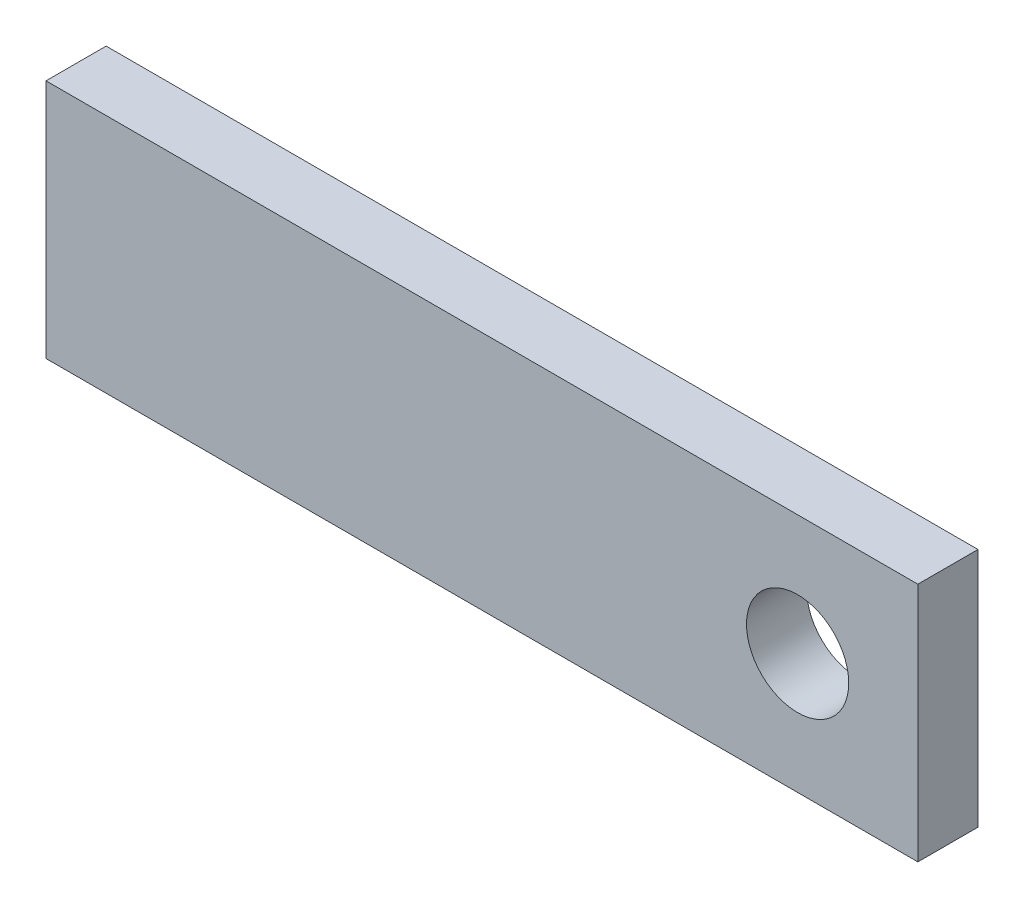
ISO-10303-21;
HEADER;
FILE_DESCRIPTION(('STEP AP214'),'2;1');
FILE_NAME('part.step','',(''),(''),'','','');
FILE_SCHEMA(('AUTOMOTIVE_DESIGN { 1 0 10303 214 1 1 1 1 }'));
ENDSEC;
DATA;
#1=APPLICATION_CONTEXT('core data for automotive mechanical design processes');
#2=APPLICATION_PROTOCOL_DEFINITION('international standard','automotive_design',2000,#1);
#3=PRODUCT_CONTEXT('',#1,'mechanical');
#4=PRODUCT('Part','Part','',(#3));
#5=PRODUCT_RELATED_PRODUCT_CATEGORY('part','',(#4));
#6=PRODUCT_DEFINITION_FORMATION('','',#4);
#7=PRODUCT_DEFINITION_CONTEXT('part definition',#1,'design');
#8=PRODUCT_DEFINITION('design','',#6,#7);
#9=PRODUCT_DEFINITION_SHAPE('','',#8);
#10=(LENGTH_UNIT() NAMED_UNIT(*) SI_UNIT(.MILLI.,.METRE.));
#11=(NAMED_UNIT(*) PLANE_ANGLE_UNIT() SI_UNIT($,.RADIAN.));
#12=(NAMED_UNIT(*) SI_UNIT($,.STERADIAN.) SOLID_ANGLE_UNIT());
#13=UNCERTAINTY_MEASURE_WITH_UNIT(LENGTH_MEASURE(1.E-05),#10,'distance_accuracy_value','');
#14=(GEOMETRIC_REPRESENTATION_CONTEXT(3) GLOBAL_UNCERTAINTY_ASSIGNED_CONTEXT((#13)) GLOBAL_UNIT_ASSIGNED_CONTEXT((#10,
#11,#12)) REPRESENTATION_CONTEXT('',''));
#15=CARTESIAN_POINT('',(0.,0.,0.));
#16=DIRECTION('',(0.,0.,1.));
#17=DIRECTION('',(1.,0.,0.));
#18=AXIS2_PLACEMENT_3D('',#15,#16,#17);
#19=CARTESIAN_POINT('',(112.,-170.,252.4));
#20=DIRECTION('',(0.,0.,1.));
#21=DIRECTION('',(1.,0.,0.));
#22=AXIS2_PLACEMENT_3D('',#19,#20,#21);
#23=CYLINDRICAL_SURFACE('',#22,1.7);
#24=DIRECTION('',(0.,0.,1.));
#25=VECTOR('',#24,1.);
#26=CARTESIAN_POINT('',(113.7,-170.,252.4));
#27=LINE('',#26,#25);
#28=CARTESIAN_POINT('',(113.7,-170.,252.5));
#29=VERTEX_POINT('',#28);
#30=CARTESIAN_POINT('',(113.7,-170.,254.5));
#31=VERTEX_POINT('',#30);
#32=EDGE_CURVE('E9',#29,#31,#27,.T.);
#33=ORIENTED_EDGE('',*,*,#32,.F.);
#34=CARTESIAN_POINT('',(112.,-170.,252.5));
#35=DIRECTION('',(0.,0.,1.));
#36=DIRECTION('',(1.,0.,0.));
#37=AXIS2_PLACEMENT_3D('',#34,#35,#36);
#38=CIRCLE('',#37,1.7);
#39=EDGE_CURVE('E25',#29,#29,#38,.T.);
#40=ORIENTED_EDGE('',*,*,#39,.F.);
#41=ORIENTED_EDGE('',*,*,#32,.T.);
#42=CARTESIAN_POINT('',(112.,-170.,254.5));
#43=DIRECTION('',(0.,0.,1.));
#44=DIRECTION('',(1.,0.,0.));
#45=AXIS2_PLACEMENT_3D('',#42,#43,#44);
#46=CIRCLE('',#45,1.7);
#47=EDGE_CURVE('E82',#31,#31,#46,.T.);
#48=ORIENTED_EDGE('',*,*,#47,.T.);
#49=EDGE_LOOP('',(#33,#40,#41,#48));
#50=FACE_BOUND('',#49,.T.);
#51=ADVANCED_FACE('F14',(#50),#23,.F.);
#52=CARTESIAN_POINT('',(116.,-174.,252.5));
#53=DIRECTION('',(1.,0.,0.));
#54=DIRECTION('',(0.,1.,0.));
#55=AXIS2_PLACEMENT_3D('',#52,#53,#54);
#56=PLANE('',#55);
#57=DIRECTION('',(0.,0.,1.));
#58=VECTOR('',#57,1.);
#59=CARTESIAN_POINT('',(116.,-174.,252.5));
#60=LINE('',#59,#58);
#61=CARTESIAN_POINT('',(116.,-174.,252.5));
#62=VERTEX_POINT('',#61);
#63=CARTESIAN_POINT('',(116.,-174.,254.5));
#64=VERTEX_POINT('',#63);
#65=EDGE_CURVE('E18',#62,#64,#60,.T.);
#66=ORIENTED_EDGE('',*,*,#65,.F.);
#67=DIRECTION('',(0.,1.,0.));
#68=VECTOR('',#67,1.);
#69=CARTESIAN_POINT('',(116.,-174.,252.5));
#70=LINE('',#69,#68);
#71=CARTESIAN_POINT('',(116.,-166.,252.5));
#72=VERTEX_POINT('',#71);
#73=EDGE_CURVE('E85',#62,#72,#70,.T.);
#74=ORIENTED_EDGE('',*,*,#73,.T.);
#75=DIRECTION('',(0.,0.,1.));
#76=VECTOR('',#75,1.);
#77=CARTESIAN_POINT('',(116.,-166.,252.5));
#78=LINE('',#77,#76);
#79=CARTESIAN_POINT('',(116.,-166.,254.5));
#80=VERTEX_POINT('',#79);
#81=EDGE_CURVE('E91',#72,#80,#78,.T.);
#82=ORIENTED_EDGE('',*,*,#81,.T.);
#83=DIRECTION('',(0.,1.,0.));
#84=VECTOR('',#83,1.);
#85=CARTESIAN_POINT('',(116.,-174.,254.5));
#86=LINE('',#85,#84);
#87=EDGE_CURVE('E96',#64,#80,#86,.T.);
#88=ORIENTED_EDGE('',*,*,#87,.F.);
#89=EDGE_LOOP('',(#66,#74,#82,#88));
#90=FACE_BOUND('',#89,.T.);
#91=ADVANCED_FACE('F136',(#90),#56,.T.);
#92=CARTESIAN_POINT('',(87.,-174.,252.5));
#93=DIRECTION('',(0.,0.,1.));
#94=DIRECTION('',(1.,0.,0.));
#95=AXIS2_PLACEMENT_3D('',#92,#93,#94);
#96=PLANE('',#95);
#97=ORIENTED_EDGE('',*,*,#39,.T.);
#98=EDGE_LOOP('',(#97));
#99=FACE_BOUND('',#98,.T.);
#100=DIRECTION('',(1.,0.,0.));
#101=VECTOR('',#100,1.);
#102=CARTESIAN_POINT('',(87.,-166.,252.5));
#103=LINE('',#102,#101);
#104=CARTESIAN_POINT('',(87.,-166.,252.5));
#105=VERTEX_POINT('',#104);
#106=EDGE_CURVE('E122',#105,#72,#103,.T.);
#107=ORIENTED_EDGE('',*,*,#106,.T.);
#108=ORIENTED_EDGE('',*,*,#73,.F.);
#109=DIRECTION('',(1.,0.,0.));
#110=VECTOR('',#109,1.);
#111=CARTESIAN_POINT('',(87.,-174.,252.5));
#112=LINE('',#111,#110);
#113=CARTESIAN_POINT('',(87.,-174.,252.5));
#114=VERTEX_POINT('',#113);
#115=EDGE_CURVE('E98',#114,#62,#112,.T.);
#116=ORIENTED_EDGE('',*,*,#115,.F.);
#117=DIRECTION('',(0.,1.,0.));
#118=VECTOR('',#117,1.);
#119=CARTESIAN_POINT('',(87.,-174.,252.5));
#120=LINE('',#119,#118);
#121=EDGE_CURVE('E104',#114,#105,#120,.T.);
#122=ORIENTED_EDGE('',*,*,#121,.T.);
#123=EDGE_LOOP('',(#107,#108,#116,#122));
#124=FACE_BOUND('',#123,.T.);
#125=ADVANCED_FACE('F142',(#99,#124),#96,.F.);
#126=CARTESIAN_POINT('',(87.,-166.,252.5));
#127=DIRECTION('',(0.,1.,0.));
#128=DIRECTION('',(1.,0.,0.));
#129=AXIS2_PLACEMENT_3D('',#126,#127,#128);
#130=PLANE('',#129);
#131=ORIENTED_EDGE('',*,*,#106,.F.);
#132=DIRECTION('',(0.,0.,1.));
#133=VECTOR('',#132,1.);
#134=CARTESIAN_POINT('',(87.,-166.,252.5));
#135=LINE('',#134,#133);
#136=CARTESIAN_POINT('',(87.,-166.,254.5));
#137=VERTEX_POINT('',#136);
#138=EDGE_CURVE('E102',#105,#137,#135,.T.);
#139=ORIENTED_EDGE('',*,*,#138,.T.);
#140=DIRECTION('',(1.,0.,0.));
#141=VECTOR('',#140,1.);
#142=CARTESIAN_POINT('',(87.,-166.,254.5));
#143=LINE('',#142,#141);
#144=EDGE_CURVE('E65',#137,#80,#143,.T.);
#145=ORIENTED_EDGE('',*,*,#144,.T.);
#146=ORIENTED_EDGE('',*,*,#81,.F.);
#147=EDGE_LOOP('',(#131,#139,#145,#146));
#148=FACE_BOUND('',#147,.T.);
#149=ADVANCED_FACE('F132',(#148),#130,.T.);
#150=CARTESIAN_POINT('',(87.,-174.,254.5));
#151=DIRECTION('',(0.,0.,1.));
#152=DIRECTION('',(1.,0.,0.));
#153=AXIS2_PLACEMENT_3D('',#150,#151,#152);
#154=PLANE('',#153);
#155=ORIENTED_EDGE('',*,*,#47,.F.);
#156=EDGE_LOOP('',(#155));
#157=FACE_BOUND('',#156,.T.);
#158=DIRECTION('',(0.,1.,0.));
#159=VECTOR('',#158,1.);
#160=CARTESIAN_POINT('',(87.,-174.,254.5));
#161=LINE('',#160,#159);
#162=CARTESIAN_POINT('',(87.,-174.,254.5));
#163=VERTEX_POINT('',#162);
#164=EDGE_CURVE('E99',#163,#137,#161,.T.);
#165=ORIENTED_EDGE('',*,*,#164,.F.);
#166=DIRECTION('',(1.,0.,0.));
#167=VECTOR('',#166,1.);
#168=CARTESIAN_POINT('',(87.,-174.,254.5));
#169=LINE('',#168,#167);
#170=EDGE_CURVE('E52',#163,#64,#169,.T.);
#171=ORIENTED_EDGE('',*,*,#170,.T.);
#172=ORIENTED_EDGE('',*,*,#87,.T.);
#173=ORIENTED_EDGE('',*,*,#144,.F.);
#174=EDGE_LOOP('',(#165,#171,#172,#173));
#175=FACE_BOUND('',#174,.T.);
#176=ADVANCED_FACE('F16',(#157,#175),#154,.T.);
#177=CARTESIAN_POINT('',(87.,-174.,252.5));
#178=DIRECTION('',(0.,1.,0.));
#179=DIRECTION('',(1.,0.,0.));
#180=AXIS2_PLACEMENT_3D('',#177,#178,#179);
#181=PLANE('',#180);
#182=ORIENTED_EDGE('',*,*,#65,.T.);
#183=ORIENTED_EDGE('',*,*,#170,.F.);
#184=DIRECTION('',(0.,0.,1.));
#185=VECTOR('',#184,1.);
#186=CARTESIAN_POINT('',(87.,-174.,252.5));
#187=LINE('',#186,#185);
#188=EDGE_CURVE('E111',#114,#163,#187,.T.);
#189=ORIENTED_EDGE('',*,*,#188,.F.);
#190=ORIENTED_EDGE('',*,*,#115,.T.);
#191=EDGE_LOOP('',(#182,#183,#189,#190));
#192=FACE_BOUND('',#191,.T.);
#193=ADVANCED_FACE('F143',(#192),#181,.F.);
#194=CARTESIAN_POINT('',(87.,-174.,252.5));
#195=DIRECTION('',(1.,0.,0.));
#196=DIRECTION('',(0.,1.,0.));
#197=AXIS2_PLACEMENT_3D('',#194,#195,#196);
#198=PLANE('',#197);
#199=ORIENTED_EDGE('',*,*,#164,.T.);
#200=ORIENTED_EDGE('',*,*,#138,.F.);
#201=ORIENTED_EDGE('',*,*,#121,.F.);
#202=ORIENTED_EDGE('',*,*,#188,.T.);
#203=EDGE_LOOP('',(#199,#200,#201,#202));
#204=FACE_BOUND('',#203,.T.);
#205=ADVANCED_FACE('F145',(#204),#198,.F.);
#206=CLOSED_SHELL('',(#51,#91,#125,#149,#176,#193,#205));
#207=MANIFOLD_SOLID_BREP('B1',#206);
#208=ADVANCED_BREP_SHAPE_REPRESENTATION('',(#18,#207),#14);
#209=SHAPE_DEFINITION_REPRESENTATION(#9,#208);
ENDSEC;
END-ISO-10303-21;
